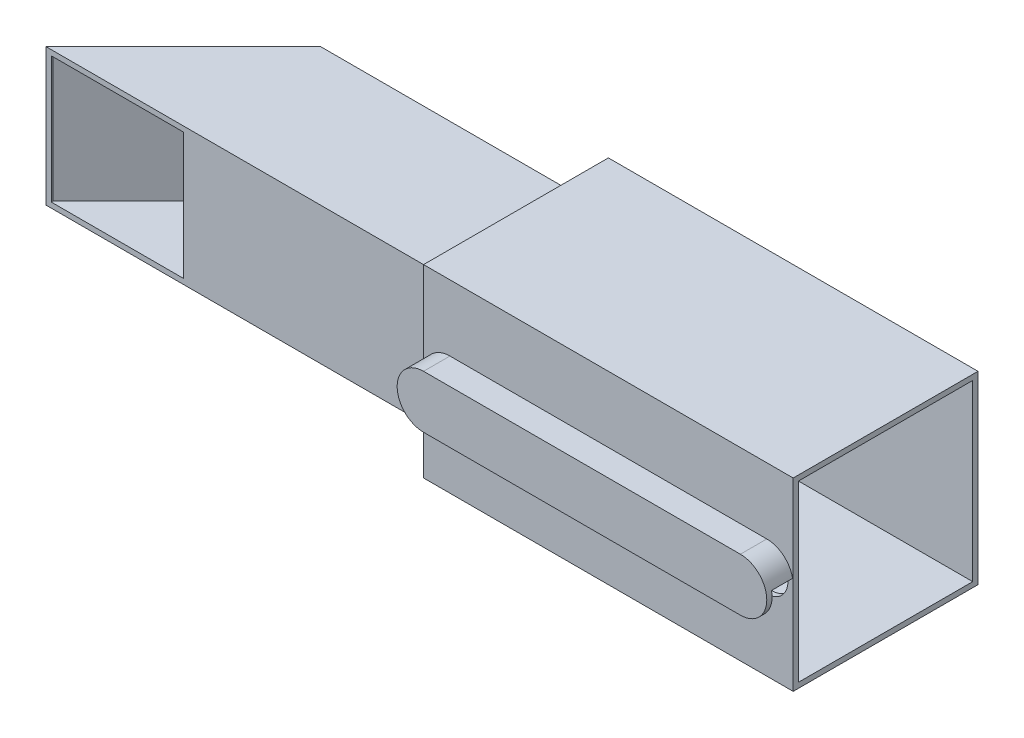
ISO-10303-21;
HEADER;
FILE_DESCRIPTION(('STEP AP214'),'2;1');
FILE_NAME('part.step','',(''),(''),'','','');
FILE_SCHEMA(('AUTOMOTIVE_DESIGN { 1 0 10303 214 1 1 1 1 }'));
ENDSEC;
DATA;
#1=APPLICATION_CONTEXT('core data for automotive mechanical design processes');
#2=APPLICATION_PROTOCOL_DEFINITION('international standard','automotive_design',2000,#1);
#3=PRODUCT_CONTEXT('',#1,'mechanical');
#4=PRODUCT('Part','Part','',(#3));
#5=PRODUCT_RELATED_PRODUCT_CATEGORY('part','',(#4));
#6=PRODUCT_DEFINITION_FORMATION('','',#4);
#7=PRODUCT_DEFINITION_CONTEXT('part definition',#1,'design');
#8=PRODUCT_DEFINITION('design','',#6,#7);
#9=PRODUCT_DEFINITION_SHAPE('','',#8);
#10=(LENGTH_UNIT() NAMED_UNIT(*) SI_UNIT(.MILLI.,.METRE.));
#11=(NAMED_UNIT(*) PLANE_ANGLE_UNIT() SI_UNIT($,.RADIAN.));
#12=(NAMED_UNIT(*) SI_UNIT($,.STERADIAN.) SOLID_ANGLE_UNIT());
#13=UNCERTAINTY_MEASURE_WITH_UNIT(LENGTH_MEASURE(1.E-05),#10,'distance_accuracy_value','');
#14=(GEOMETRIC_REPRESENTATION_CONTEXT(3) GLOBAL_UNCERTAINTY_ASSIGNED_CONTEXT((#13)) GLOBAL_UNIT_ASSIGNED_CONTEXT((#10,
#11,#12)) REPRESENTATION_CONTEXT('',''));
#15=CARTESIAN_POINT('',(0.,0.,0.));
#16=DIRECTION('',(0.,0.,1.));
#17=DIRECTION('',(1.,0.,0.));
#18=AXIS2_PLACEMENT_3D('',#15,#16,#17);
#19=CARTESIAN_POINT('',(70.,17.5,17.5));
#20=DIRECTION('',(-1.,0.,0.));
#21=DIRECTION('',(0.,0.,1.));
#22=AXIS2_PLACEMENT_3D('',#19,#20,#21);
#23=PLANE('',#22);
#24=DIRECTION('',(0.,1.,0.));
#25=VECTOR('',#24,1.);
#26=CARTESIAN_POINT('',(70.,17.5,-17.5));
#27=LINE('',#26,#25);
#28=CARTESIAN_POINT('',(70.,-17.5,-17.5));
#29=VERTEX_POINT('',#28);
#30=CARTESIAN_POINT('',(70.,17.5,-17.5));
#31=VERTEX_POINT('',#30);
#32=EDGE_CURVE('E487',#29,#31,#27,.T.);
#33=ORIENTED_EDGE('',*,*,#32,.T.);
#34=DIRECTION('',(0.,0.,-1.));
#35=VECTOR('',#34,1.);
#36=CARTESIAN_POINT('',(70.,17.5,17.5));
#37=LINE('',#36,#35);
#38=CARTESIAN_POINT('',(70.,17.5,17.5));
#39=VERTEX_POINT('',#38);
#40=EDGE_CURVE('E497',#39,#31,#37,.T.);
#41=ORIENTED_EDGE('',*,*,#40,.F.);
#42=DIRECTION('',(0.,1.,0.));
#43=VECTOR('',#42,1.);
#44=CARTESIAN_POINT('',(70.,17.5,17.5));
#45=LINE('',#44,#43);
#46=CARTESIAN_POINT('',(70.,-17.5,17.5));
#47=VERTEX_POINT('',#46);
#48=EDGE_CURVE('E477',#47,#39,#45,.T.);
#49=ORIENTED_EDGE('',*,*,#48,.F.);
#50=DIRECTION('',(0.,0.,-1.));
#51=VECTOR('',#50,1.);
#52=CARTESIAN_POINT('',(70.,-17.5,17.5));
#53=LINE('',#52,#51);
#54=EDGE_CURVE('E455',#47,#29,#53,.T.);
#55=ORIENTED_EDGE('',*,*,#54,.T.);
#56=EDGE_LOOP('',(#33,#41,#49,#55));
#57=FACE_BOUND('',#56,.T.);
#58=DIRECTION('',(0.,1.,0.));
#59=VECTOR('',#58,1.);
#60=CARTESIAN_POINT('',(70.,17.5,-16.5));
#61=LINE('',#60,#59);
#62=CARTESIAN_POINT('',(70.,-16.5,-16.5));
#63=VERTEX_POINT('',#62);
#64=CARTESIAN_POINT('',(70.,16.5,-16.5));
#65=VERTEX_POINT('',#64);
#66=EDGE_CURVE('E413',#63,#65,#61,.T.);
#67=ORIENTED_EDGE('',*,*,#66,.F.);
#68=DIRECTION('',(0.,0.,-1.));
#69=VECTOR('',#68,1.);
#70=CARTESIAN_POINT('',(70.,-16.5,17.5));
#71=LINE('',#70,#69);
#72=CARTESIAN_POINT('',(70.,-16.5,16.5));
#73=VERTEX_POINT('',#72);
#74=EDGE_CURVE('E400',#73,#63,#71,.T.);
#75=ORIENTED_EDGE('',*,*,#74,.F.);
#76=DIRECTION('',(0.,1.,0.));
#77=VECTOR('',#76,1.);
#78=CARTESIAN_POINT('',(70.,17.5,16.5));
#79=LINE('',#78,#77);
#80=CARTESIAN_POINT('',(70.,16.5,16.5));
#81=VERTEX_POINT('',#80);
#82=EDGE_CURVE('E394',#73,#81,#79,.T.);
#83=ORIENTED_EDGE('',*,*,#82,.T.);
#84=DIRECTION('',(0.,0.,-1.));
#85=VECTOR('',#84,1.);
#86=CARTESIAN_POINT('',(70.,16.5,17.5));
#87=LINE('',#86,#85);
#88=EDGE_CURVE('E417',#81,#65,#87,.T.);
#89=ORIENTED_EDGE('',*,*,#88,.T.);
#90=EDGE_LOOP('',(#67,#75,#83,#89));
#91=FACE_BOUND('',#90,.T.);
#92=ADVANCED_FACE('F40',(#57,#91),#23,.F.);
#93=CARTESIAN_POINT('',(0.,0.,17.5));
#94=DIRECTION('',(0.,0.,1.));
#95=DIRECTION('',(1.,0.,0.));
#96=AXIS2_PLACEMENT_3D('',#93,#94,#95);
#97=PLANE('',#96);
#98=ORIENTED_EDGE('',*,*,#48,.T.);
#99=DIRECTION('',(-1.,0.,0.));
#100=VECTOR('',#99,1.);
#101=CARTESIAN_POINT('',(70.,17.5,17.5));
#102=LINE('',#101,#100);
#103=CARTESIAN_POINT('',(0.,17.5,17.5));
#104=VERTEX_POINT('',#103);
#105=EDGE_CURVE('E480',#39,#104,#102,.T.);
#106=ORIENTED_EDGE('',*,*,#105,.T.);
#107=DIRECTION('',(0.,-1.,0.));
#108=VECTOR('',#107,1.);
#109=CARTESIAN_POINT('',(0.,17.5,17.5));
#110=LINE('',#109,#108);
#111=CARTESIAN_POINT('',(0.,-17.5,17.5));
#112=VERTEX_POINT('',#111);
#113=EDGE_CURVE('E482',#104,#112,#110,.T.);
#114=ORIENTED_EDGE('',*,*,#113,.T.);
#115=DIRECTION('',(1.,0.,0.));
#116=VECTOR('',#115,1.);
#117=CARTESIAN_POINT('',(70.,-17.5,17.5));
#118=LINE('',#117,#116);
#119=EDGE_CURVE('E474',#112,#47,#118,.T.);
#120=ORIENTED_EDGE('',*,*,#119,.T.);
#121=EDGE_LOOP('',(#98,#106,#114,#120));
#122=FACE_BOUND('',#121,.T.);
#123=DIRECTION('',(1.,0.,0.));
#124=VECTOR('',#123,1.);
#125=CARTESIAN_POINT('',(0.,1.00000000000001,17.5));
#126=LINE('',#125,#124);
#127=CARTESIAN_POINT('',(0.101020514433658,1.00000000000001,17.5));
#128=VERTEX_POINT('',#127);
#129=CARTESIAN_POINT('',(1.1270166537926,1.00000000000001,17.5));
#130=VERTEX_POINT('',#129);
#131=EDGE_CURVE('E353',#128,#130,#126,.T.);
#132=ORIENTED_EDGE('',*,*,#131,.F.);
#133=CARTESIAN_POINT('',(5.,0.,17.5));
#134=DIRECTION('',(0.,0.,1.));
#135=DIRECTION('',(1.,0.,0.));
#136=AXIS2_PLACEMENT_3D('',#133,#134,#135);
#137=CIRCLE('',#136,4.99999999999999);
#138=CARTESIAN_POINT('',(5.,4.99999999999999,17.5));
#139=VERTEX_POINT('',#138);
#140=EDGE_CURVE('E48',#128,#139,#137,.F.);
#141=ORIENTED_EDGE('',*,*,#140,.T.);
#142=DIRECTION('',(1.,0.,0.));
#143=VECTOR('',#142,1.);
#144=CARTESIAN_POINT('',(5.,4.99999999999999,17.5));
#145=LINE('',#144,#143);
#146=CARTESIAN_POINT('',(65.,4.99999999999998,17.5));
#147=VERTEX_POINT('',#146);
#148=EDGE_CURVE('E449',#139,#147,#145,.T.);
#149=ORIENTED_EDGE('',*,*,#148,.T.);
#150=CARTESIAN_POINT('',(65.,0.,17.5));
#151=DIRECTION('',(0.,0.,1.));
#152=DIRECTION('',(1.,0.,0.));
#153=AXIS2_PLACEMENT_3D('',#150,#151,#152);
#154=CIRCLE('',#153,4.99999999999999);
#155=CARTESIAN_POINT('',(69.8989794855663,1.00000000000001,17.5));
#156=VERTEX_POINT('',#155);
#157=EDGE_CURVE('E446',#147,#156,#154,.F.);
#158=ORIENTED_EDGE('',*,*,#157,.T.);
#159=CARTESIAN_POINT('',(68.8729833462074,1.00000000000001,17.5));
#160=VERTEX_POINT('',#159);
#161=EDGE_CURVE('E351',#160,#156,#126,.T.);
#162=ORIENTED_EDGE('',*,*,#161,.F.);
#163=CARTESIAN_POINT('',(65.,0.,17.5));
#164=DIRECTION('',(0.,0.,-1.));
#165=DIRECTION('',(-1.,0.,0.));
#166=AXIS2_PLACEMENT_3D('',#163,#164,#165);
#167=CIRCLE('',#166,3.99999999999999);
#168=CARTESIAN_POINT('',(65.,-3.99999999999999,17.5));
#169=VERTEX_POINT('',#168);
#170=EDGE_CURVE('E373',#169,#160,#167,.F.);
#171=ORIENTED_EDGE('',*,*,#170,.F.);
#172=DIRECTION('',(1.,0.,0.));
#173=VECTOR('',#172,1.);
#174=CARTESIAN_POINT('',(5.,-3.99999999999999,17.5));
#175=LINE('',#174,#173);
#176=CARTESIAN_POINT('',(5.,-3.99999999999999,17.5));
#177=VERTEX_POINT('',#176);
#178=EDGE_CURVE('E12',#177,#169,#175,.T.);
#179=ORIENTED_EDGE('',*,*,#178,.F.);
#180=CARTESIAN_POINT('',(5.,0.,17.5));
#181=DIRECTION('',(0.,0.,-1.));
#182=DIRECTION('',(-1.,0.,0.));
#183=AXIS2_PLACEMENT_3D('',#180,#181,#182);
#184=CIRCLE('',#183,3.99999999999999);
#185=EDGE_CURVE('E376',#130,#177,#184,.F.);
#186=ORIENTED_EDGE('',*,*,#185,.F.);
#187=EDGE_LOOP('',(#132,#141,#149,#158,#162,#171,#179,#186));
#188=FACE_BOUND('',#187,.T.);
#189=ADVANCED_FACE('F520',(#122,#188),#97,.T.);
#190=CARTESIAN_POINT('',(70.,-17.5,17.5));
#191=DIRECTION('',(0.,1.,0.));
#192=DIRECTION('',(-1.,0.,0.));
#193=AXIS2_PLACEMENT_3D('',#190,#191,#192);
#194=PLANE('',#193);
#195=DIRECTION('',(1.,0.,0.));
#196=VECTOR('',#195,1.);
#197=CARTESIAN_POINT('',(70.,-17.5,-17.5));
#198=LINE('',#197,#196);
#199=CARTESIAN_POINT('',(0.,-17.5,-17.5));
#200=VERTEX_POINT('',#199);
#201=EDGE_CURVE('E453',#200,#29,#198,.T.);
#202=ORIENTED_EDGE('',*,*,#201,.T.);
#203=ORIENTED_EDGE('',*,*,#54,.F.);
#204=ORIENTED_EDGE('',*,*,#119,.F.);
#205=DIRECTION('',(0.,0.,-1.));
#206=VECTOR('',#205,1.);
#207=CARTESIAN_POINT('',(0.,-17.5,17.5));
#208=LINE('',#207,#206);
#209=EDGE_CURVE('E484',#112,#200,#208,.T.);
#210=ORIENTED_EDGE('',*,*,#209,.T.);
#211=EDGE_LOOP('',(#202,#203,#204,#210));
#212=FACE_BOUND('',#211,.T.);
#213=ADVANCED_FACE('F42',(#212),#194,.F.);
#214=CARTESIAN_POINT('',(70.,17.5,17.5));
#215=DIRECTION('',(0.,-1.,0.));
#216=DIRECTION('',(1.,0.,0.));
#217=AXIS2_PLACEMENT_3D('',#214,#215,#216);
#218=PLANE('',#217);
#219=DIRECTION('',(-1.,0.,0.));
#220=VECTOR('',#219,1.);
#221=CARTESIAN_POINT('',(70.,17.5,-17.5));
#222=LINE('',#221,#220);
#223=CARTESIAN_POINT('',(0.,17.5,-17.5));
#224=VERTEX_POINT('',#223);
#225=EDGE_CURVE('E489',#31,#224,#222,.T.);
#226=ORIENTED_EDGE('',*,*,#225,.T.);
#227=DIRECTION('',(0.,0.,-1.));
#228=VECTOR('',#227,1.);
#229=CARTESIAN_POINT('',(0.,17.5,17.5));
#230=LINE('',#229,#228);
#231=EDGE_CURVE('E494',#104,#224,#230,.T.);
#232=ORIENTED_EDGE('',*,*,#231,.F.);
#233=ORIENTED_EDGE('',*,*,#105,.F.);
#234=ORIENTED_EDGE('',*,*,#40,.T.);
#235=EDGE_LOOP('',(#226,#232,#233,#234));
#236=FACE_BOUND('',#235,.T.);
#237=ADVANCED_FACE('F514',(#236),#218,.F.);
#238=CARTESIAN_POINT('',(0.,17.5,17.5));
#239=DIRECTION('',(1.,0.,0.));
#240=DIRECTION('',(0.,0.,-1.));
#241=AXIS2_PLACEMENT_3D('',#238,#239,#240);
#242=PLANE('',#241);
#243=DIRECTION('',(0.,0.,-1.));
#244=VECTOR('',#243,1.);
#245=CARTESIAN_POINT('',(0.,-13.,13.));
#246=LINE('',#245,#244);
#247=CARTESIAN_POINT('',(0.,-13.,13.));
#248=VERTEX_POINT('',#247);
#249=CARTESIAN_POINT('',(0.,-13.,-13.));
#250=VERTEX_POINT('',#249);
#251=EDGE_CURVE('E347',#248,#250,#246,.T.);
#252=ORIENTED_EDGE('',*,*,#251,.T.);
#253=DIRECTION('',(0.,1.,0.));
#254=VECTOR('',#253,1.);
#255=CARTESIAN_POINT('',(0.,-13.,-13.));
#256=LINE('',#255,#254);
#257=CARTESIAN_POINT('',(0.,13.,-13.));
#258=VERTEX_POINT('',#257);
#259=EDGE_CURVE('E338',#250,#258,#256,.T.);
#260=ORIENTED_EDGE('',*,*,#259,.T.);
#261=DIRECTION('',(0.,0.,-1.));
#262=VECTOR('',#261,1.);
#263=CARTESIAN_POINT('',(0.,13.,13.));
#264=LINE('',#263,#262);
#265=CARTESIAN_POINT('',(0.,13.,13.));
#266=VERTEX_POINT('',#265);
#267=EDGE_CURVE('E336',#266,#258,#264,.T.);
#268=ORIENTED_EDGE('',*,*,#267,.F.);
#269=DIRECTION('',(0.,1.,0.));
#270=VECTOR('',#269,1.);
#271=CARTESIAN_POINT('',(0.,-13.,13.));
#272=LINE('',#271,#270);
#273=EDGE_CURVE('E331',#248,#266,#272,.T.);
#274=ORIENTED_EDGE('',*,*,#273,.F.);
#275=EDGE_LOOP('',(#252,#260,#268,#274));
#276=FACE_BOUND('',#275,.T.);
#277=DIRECTION('',(0.,-1.,0.));
#278=VECTOR('',#277,1.);
#279=CARTESIAN_POINT('',(0.,17.5,-17.5));
#280=LINE('',#279,#278);
#281=EDGE_CURVE('E478',#224,#200,#280,.T.);
#282=ORIENTED_EDGE('',*,*,#281,.T.);
#283=ORIENTED_EDGE('',*,*,#209,.F.);
#284=ORIENTED_EDGE('',*,*,#113,.F.);
#285=ORIENTED_EDGE('',*,*,#231,.T.);
#286=EDGE_LOOP('',(#282,#283,#284,#285));
#287=FACE_BOUND('',#286,.T.);
#288=ADVANCED_FACE('F518',(#276,#287),#242,.F.);
#289=CARTESIAN_POINT('',(0.,0.,-17.5));
#290=DIRECTION('',(0.,0.,1.));
#291=DIRECTION('',(1.,0.,0.));
#292=AXIS2_PLACEMENT_3D('',#289,#290,#291);
#293=PLANE('',#292);
#294=ORIENTED_EDGE('',*,*,#201,.F.);
#295=ORIENTED_EDGE('',*,*,#281,.F.);
#296=ORIENTED_EDGE('',*,*,#225,.F.);
#297=ORIENTED_EDGE('',*,*,#32,.F.);
#298=EDGE_LOOP('',(#294,#295,#296,#297));
#299=FACE_BOUND('',#298,.T.);
#300=ADVANCED_FACE('F510',(#299),#293,.F.);
#301=CARTESIAN_POINT('',(5.,0.,-53.2106781186547));
#302=DIRECTION('',(0.,0.,1.));
#303=DIRECTION('',(1.,0.,0.));
#304=AXIS2_PLACEMENT_3D('',#301,#302,#303);
#305=CYLINDRICAL_SURFACE('',#304,4.99999999999999);
#306=CARTESIAN_POINT('',(5.,0.,21.5));
#307=DIRECTION('',(0.,0.,1.));
#308=DIRECTION('',(1.,0.,0.));
#309=AXIS2_PLACEMENT_3D('',#306,#307,#308);
#310=CIRCLE('',#309,4.99999999999999);
#311=CARTESIAN_POINT('',(5.,-4.99999999999999,21.5));
#312=VERTEX_POINT('',#311);
#313=CARTESIAN_POINT('',(0.101020514433658,1.00000000000001,21.5));
#314=VERTEX_POINT('',#313);
#315=EDGE_CURVE('E371',#312,#314,#310,.F.);
#316=ORIENTED_EDGE('',*,*,#315,.F.);
#317=DIRECTION('',(0.,0.,1.));
#318=VECTOR('',#317,1.);
#319=CARTESIAN_POINT('',(5.,-4.99999999999999,-53.2106781186547));
#320=LINE('',#319,#318);
#321=CARTESIAN_POINT('',(5.,-4.99999999999999,22.5));
#322=VERTEX_POINT('',#321);
#323=EDGE_CURVE('E467',#312,#322,#320,.T.);
#324=ORIENTED_EDGE('',*,*,#323,.T.);
#325=CARTESIAN_POINT('',(5.,0.,22.5));
#326=DIRECTION('',(0.,0.,1.));
#327=DIRECTION('',(1.,0.,0.));
#328=AXIS2_PLACEMENT_3D('',#325,#326,#327);
#329=CIRCLE('',#328,4.99999999999999);
#330=CARTESIAN_POINT('',(5.,4.99999999999999,22.5));
#331=VERTEX_POINT('',#330);
#332=EDGE_CURVE('E406',#331,#322,#329,.T.);
#333=ORIENTED_EDGE('',*,*,#332,.F.);
#334=DIRECTION('',(0.,0.,1.));
#335=VECTOR('',#334,1.);
#336=CARTESIAN_POINT('',(5.,4.99999999999999,-53.2106781186547));
#337=LINE('',#336,#335);
#338=EDGE_CURVE('E450',#139,#331,#337,.T.);
#339=ORIENTED_EDGE('',*,*,#338,.F.);
#340=ORIENTED_EDGE('',*,*,#140,.F.);
#341=DIRECTION('',(0.,0.,1.));
#342=VECTOR('',#341,1.);
#343=CARTESIAN_POINT('',(0.101020514433658,1.00000000000001,-53.2106781186547));
#344=LINE('',#343,#342);
#345=EDGE_CURVE('E366',#128,#314,#344,.T.);
#346=ORIENTED_EDGE('',*,*,#345,.T.);
#347=EDGE_LOOP('',(#316,#324,#333,#339,#340,#346));
#348=FACE_BOUND('',#347,.T.);
#349=ADVANCED_FACE('F533',(#348),#305,.T.);
#350=CARTESIAN_POINT('',(5.,4.99999999999999,-53.2106781186547));
#351=DIRECTION('',(0.,1.,0.));
#352=DIRECTION('',(0.,0.,1.));
#353=AXIS2_PLACEMENT_3D('',#350,#351,#352);
#354=PLANE('',#353);
#355=ORIENTED_EDGE('',*,*,#148,.F.);
#356=ORIENTED_EDGE('',*,*,#338,.T.);
#357=DIRECTION('',(-1.,0.,0.));
#358=VECTOR('',#357,1.);
#359=CARTESIAN_POINT('',(5.,4.99999999999999,22.5));
#360=LINE('',#359,#358);
#361=CARTESIAN_POINT('',(65.,4.99999999999998,22.5));
#362=VERTEX_POINT('',#361);
#363=EDGE_CURVE('E464',#362,#331,#360,.T.);
#364=ORIENTED_EDGE('',*,*,#363,.F.);
#365=DIRECTION('',(0.,0.,1.));
#366=VECTOR('',#365,1.);
#367=CARTESIAN_POINT('',(65.,4.99999999999998,-53.2106781186547));
#368=LINE('',#367,#366);
#369=EDGE_CURVE('E469',#147,#362,#368,.T.);
#370=ORIENTED_EDGE('',*,*,#369,.F.);
#371=EDGE_LOOP('',(#355,#356,#364,#370));
#372=FACE_BOUND('',#371,.T.);
#373=ADVANCED_FACE('F537',(#372),#354,.T.);
#374=CARTESIAN_POINT('',(65.,0.,-53.2106781186547));
#375=DIRECTION('',(0.,0.,1.));
#376=DIRECTION('',(1.,0.,0.));
#377=AXIS2_PLACEMENT_3D('',#374,#375,#376);
#378=CYLINDRICAL_SURFACE('',#377,4.99999999999999);
#379=CARTESIAN_POINT('',(65.,0.,21.5));
#380=DIRECTION('',(0.,0.,1.));
#381=DIRECTION('',(1.,0.,0.));
#382=AXIS2_PLACEMENT_3D('',#379,#380,#381);
#383=CIRCLE('',#382,4.99999999999999);
#384=CARTESIAN_POINT('',(69.8989794855663,1.00000000000001,21.5));
#385=VERTEX_POINT('',#384);
#386=CARTESIAN_POINT('',(65.,-4.99999999999999,21.5));
#387=VERTEX_POINT('',#386);
#388=EDGE_CURVE('E369',#385,#387,#383,.F.);
#389=ORIENTED_EDGE('',*,*,#388,.F.);
#390=DIRECTION('',(0.,0.,1.));
#391=VECTOR('',#390,1.);
#392=CARTESIAN_POINT('',(69.8989794855663,1.00000000000001,-53.2106781186547));
#393=LINE('',#392,#391);
#394=EDGE_CURVE('E363',#385,#156,#393,.F.);
#395=ORIENTED_EDGE('',*,*,#394,.T.);
#396=ORIENTED_EDGE('',*,*,#157,.F.);
#397=ORIENTED_EDGE('',*,*,#369,.T.);
#398=CARTESIAN_POINT('',(65.,0.,22.5));
#399=DIRECTION('',(0.,0.,1.));
#400=DIRECTION('',(1.,0.,0.));
#401=AXIS2_PLACEMENT_3D('',#398,#399,#400);
#402=CIRCLE('',#401,4.99999999999999);
#403=CARTESIAN_POINT('',(65.,-4.99999999999999,22.5));
#404=VERTEX_POINT('',#403);
#405=EDGE_CURVE('E461',#404,#362,#402,.T.);
#406=ORIENTED_EDGE('',*,*,#405,.F.);
#407=DIRECTION('',(0.,0.,1.));
#408=VECTOR('',#407,1.);
#409=CARTESIAN_POINT('',(65.,-4.99999999999999,-53.2106781186547));
#410=LINE('',#409,#408);
#411=EDGE_CURVE('E471',#387,#404,#410,.T.);
#412=ORIENTED_EDGE('',*,*,#411,.F.);
#413=EDGE_LOOP('',(#389,#395,#396,#397,#406,#412));
#414=FACE_BOUND('',#413,.T.);
#415=ADVANCED_FACE('F541',(#414),#378,.T.);
#416=CARTESIAN_POINT('',(5.,-4.99999999999999,-53.2106781186547));
#417=DIRECTION('',(0.,-1.,0.));
#418=DIRECTION('',(0.,0.,-1.));
#419=AXIS2_PLACEMENT_3D('',#416,#417,#418);
#420=PLANE('',#419);
#421=DIRECTION('',(-1.,0.,0.));
#422=VECTOR('',#421,1.);
#423=CARTESIAN_POINT('',(0.,-4.99999999999999,21.5));
#424=LINE('',#423,#422);
#425=EDGE_CURVE('E350',#387,#312,#424,.T.);
#426=ORIENTED_EDGE('',*,*,#425,.F.);
#427=ORIENTED_EDGE('',*,*,#411,.T.);
#428=DIRECTION('',(1.,0.,0.));
#429=VECTOR('',#428,1.);
#430=CARTESIAN_POINT('',(5.,-4.99999999999999,22.5));
#431=LINE('',#430,#429);
#432=EDGE_CURVE('E458',#322,#404,#431,.T.);
#433=ORIENTED_EDGE('',*,*,#432,.F.);
#434=ORIENTED_EDGE('',*,*,#323,.F.);
#435=EDGE_LOOP('',(#426,#427,#433,#434));
#436=FACE_BOUND('',#435,.T.);
#437=ADVANCED_FACE('F575',(#436),#420,.T.);
#438=CARTESIAN_POINT('',(5.,0.,22.5));
#439=DIRECTION('',(0.,0.,1.));
#440=DIRECTION('',(1.,0.,0.));
#441=AXIS2_PLACEMENT_3D('',#438,#439,#440);
#442=PLANE('',#441);
#443=ORIENTED_EDGE('',*,*,#332,.T.);
#444=ORIENTED_EDGE('',*,*,#432,.T.);
#445=ORIENTED_EDGE('',*,*,#405,.T.);
#446=ORIENTED_EDGE('',*,*,#363,.T.);
#447=EDGE_LOOP('',(#443,#444,#445,#446));
#448=FACE_BOUND('',#447,.T.);
#449=ADVANCED_FACE('F577',(#448),#442,.T.);
#450=CARTESIAN_POINT('',(0.,0.,16.5));
#451=DIRECTION('',(0.,0.,1.));
#452=DIRECTION('',(1.,0.,0.));
#453=AXIS2_PLACEMENT_3D('',#450,#451,#452);
#454=PLANE('',#453);
#455=DIRECTION('',(0.,-1.,0.));
#456=VECTOR('',#455,1.);
#457=CARTESIAN_POINT('',(1.,17.5,16.5));
#458=LINE('',#457,#456);
#459=CARTESIAN_POINT('',(1.,16.5,16.5));
#460=VERTEX_POINT('',#459);
#461=CARTESIAN_POINT('',(1.,0.,16.5));
#462=VERTEX_POINT('',#461);
#463=EDGE_CURVE('E390',#460,#462,#458,.T.);
#464=ORIENTED_EDGE('',*,*,#463,.F.);
#465=DIRECTION('',(-1.,0.,0.));
#466=VECTOR('',#465,1.);
#467=CARTESIAN_POINT('',(70.,16.5,16.5));
#468=LINE('',#467,#466);
#469=EDGE_CURVE('E391',#81,#460,#468,.T.);
#470=ORIENTED_EDGE('',*,*,#469,.F.);
#471=ORIENTED_EDGE('',*,*,#82,.F.);
#472=DIRECTION('',(1.,0.,0.));
#473=VECTOR('',#472,1.);
#474=CARTESIAN_POINT('',(70.,-16.5,16.5));
#475=LINE('',#474,#473);
#476=CARTESIAN_POINT('',(1.,-16.5,16.5));
#477=VERTEX_POINT('',#476);
#478=EDGE_CURVE('E392',#477,#73,#475,.T.);
#479=ORIENTED_EDGE('',*,*,#478,.F.);
#480=DIRECTION('',(0.,-1.,0.));
#481=VECTOR('',#480,1.);
#482=CARTESIAN_POINT('',(1.,17.5,16.5));
#483=LINE('',#482,#481);
#484=EDGE_CURVE('E388',#462,#477,#483,.T.);
#485=ORIENTED_EDGE('',*,*,#484,.F.);
#486=CARTESIAN_POINT('',(5.,0.,16.5));
#487=DIRECTION('',(0.,0.,1.));
#488=DIRECTION('',(1.,0.,0.));
#489=AXIS2_PLACEMENT_3D('',#486,#487,#488);
#490=CIRCLE('',#489,3.99999999999999);
#491=CARTESIAN_POINT('',(5.,-4.,16.5));
#492=VERTEX_POINT('',#491);
#493=EDGE_CURVE('E384',#492,#462,#490,.F.);
#494=ORIENTED_EDGE('',*,*,#493,.F.);
#495=DIRECTION('',(-1.,0.,0.));
#496=VECTOR('',#495,1.);
#497=CARTESIAN_POINT('',(5.,-3.99999999999999,16.5));
#498=LINE('',#497,#496);
#499=CARTESIAN_POINT('',(65.,-3.99999999999999,16.5));
#500=VERTEX_POINT('',#499);
#501=EDGE_CURVE('E380',#500,#492,#498,.T.);
#502=ORIENTED_EDGE('',*,*,#501,.F.);
#503=CARTESIAN_POINT('',(65.,0.,16.5));
#504=DIRECTION('',(0.,0.,1.));
#505=DIRECTION('',(1.,0.,0.));
#506=AXIS2_PLACEMENT_3D('',#503,#504,#505);
#507=CIRCLE('',#506,3.99999999999999);
#508=CARTESIAN_POINT('',(65.,3.99999999999998,16.5));
#509=VERTEX_POINT('',#508);
#510=EDGE_CURVE('E396',#509,#500,#507,.F.);
#511=ORIENTED_EDGE('',*,*,#510,.F.);
#512=DIRECTION('',(1.,0.,0.));
#513=VECTOR('',#512,1.);
#514=CARTESIAN_POINT('',(5.,3.99999999999999,16.5));
#515=LINE('',#514,#513);
#516=CARTESIAN_POINT('',(5.,3.99999999999999,16.5));
#517=VERTEX_POINT('',#516);
#518=EDGE_CURVE('E387',#517,#509,#515,.T.);
#519=ORIENTED_EDGE('',*,*,#518,.F.);
#520=CARTESIAN_POINT('',(5.,0.,16.5));
#521=DIRECTION('',(0.,0.,1.));
#522=DIRECTION('',(1.,0.,0.));
#523=AXIS2_PLACEMENT_3D('',#520,#521,#522);
#524=CIRCLE('',#523,3.99999999999999);
#525=EDGE_CURVE('E399',#462,#517,#524,.F.);
#526=ORIENTED_EDGE('',*,*,#525,.F.);
#527=EDGE_LOOP('',(#464,#470,#471,#479,#485,#494,#502,#511,#519,#526));
#528=FACE_BOUND('',#527,.T.);
#529=ADVANCED_FACE('F563',(#528),#454,.F.);
#530=CARTESIAN_POINT('',(70.,-16.5,17.5));
#531=DIRECTION('',(0.,1.,0.));
#532=DIRECTION('',(-1.,0.,0.));
#533=AXIS2_PLACEMENT_3D('',#530,#531,#532);
#534=PLANE('',#533);
#535=DIRECTION('',(1.,0.,0.));
#536=VECTOR('',#535,1.);
#537=CARTESIAN_POINT('',(70.,-16.5,-16.5));
#538=LINE('',#537,#536);
#539=CARTESIAN_POINT('',(1.,-16.5,-16.5));
#540=VERTEX_POINT('',#539);
#541=EDGE_CURVE('E383',#540,#63,#538,.T.);
#542=ORIENTED_EDGE('',*,*,#541,.F.);
#543=DIRECTION('',(0.,0.,-1.));
#544=VECTOR('',#543,1.);
#545=CARTESIAN_POINT('',(1.,-16.5,17.5));
#546=LINE('',#545,#544);
#547=EDGE_CURVE('E403',#477,#540,#546,.T.);
#548=ORIENTED_EDGE('',*,*,#547,.F.);
#549=ORIENTED_EDGE('',*,*,#478,.T.);
#550=ORIENTED_EDGE('',*,*,#74,.T.);
#551=EDGE_LOOP('',(#542,#548,#549,#550));
#552=FACE_BOUND('',#551,.T.);
#553=ADVANCED_FACE('F584',(#552),#534,.T.);
#554=CARTESIAN_POINT('',(70.,16.5,17.5));
#555=DIRECTION('',(0.,-1.,0.));
#556=DIRECTION('',(1.,0.,0.));
#557=AXIS2_PLACEMENT_3D('',#554,#555,#556);
#558=PLANE('',#557);
#559=DIRECTION('',(-1.,0.,0.));
#560=VECTOR('',#559,1.);
#561=CARTESIAN_POINT('',(70.,16.5,-16.5));
#562=LINE('',#561,#560);
#563=CARTESIAN_POINT('',(1.,16.5,-16.5));
#564=VERTEX_POINT('',#563);
#565=EDGE_CURVE('E411',#65,#564,#562,.T.);
#566=ORIENTED_EDGE('',*,*,#565,.F.);
#567=ORIENTED_EDGE('',*,*,#88,.F.);
#568=ORIENTED_EDGE('',*,*,#469,.T.);
#569=DIRECTION('',(0.,0.,-1.));
#570=VECTOR('',#569,1.);
#571=CARTESIAN_POINT('',(1.,16.5,17.5));
#572=LINE('',#571,#570);
#573=EDGE_CURVE('E414',#460,#564,#572,.T.);
#574=ORIENTED_EDGE('',*,*,#573,.T.);
#575=EDGE_LOOP('',(#566,#567,#568,#574));
#576=FACE_BOUND('',#575,.T.);
#577=ADVANCED_FACE('F665',(#576),#558,.T.);
#578=CARTESIAN_POINT('',(1.,17.5,17.5));
#579=DIRECTION('',(1.,0.,0.));
#580=DIRECTION('',(0.,0.,-1.));
#581=AXIS2_PLACEMENT_3D('',#578,#579,#580);
#582=PLANE('',#581);
#583=DIRECTION('',(0.,0.,1.));
#584=VECTOR('',#583,1.);
#585=CARTESIAN_POINT('',(1.,-12.,-12.));
#586=LINE('',#585,#584);
#587=CARTESIAN_POINT('',(1.,-12.,-12.));
#588=VERTEX_POINT('',#587);
#589=CARTESIAN_POINT('',(1.,-12.,12.));
#590=VERTEX_POINT('',#589);
#591=EDGE_CURVE('E305',#588,#590,#586,.T.);
#592=ORIENTED_EDGE('',*,*,#591,.T.);
#593=DIRECTION('',(0.,1.,0.));
#594=VECTOR('',#593,1.);
#595=CARTESIAN_POINT('',(1.,-12.,12.));
#596=LINE('',#595,#594);
#597=CARTESIAN_POINT('',(1.,12.,12.));
#598=VERTEX_POINT('',#597);
#599=EDGE_CURVE('E308',#590,#598,#596,.T.);
#600=ORIENTED_EDGE('',*,*,#599,.T.);
#601=DIRECTION('',(0.,0.,-1.));
#602=VECTOR('',#601,1.);
#603=CARTESIAN_POINT('',(1.,12.,-12.));
#604=LINE('',#603,#602);
#605=CARTESIAN_POINT('',(1.,12.,-12.));
#606=VERTEX_POINT('',#605);
#607=EDGE_CURVE('E312',#598,#606,#604,.T.);
#608=ORIENTED_EDGE('',*,*,#607,.T.);
#609=DIRECTION('',(0.,-1.,0.));
#610=VECTOR('',#609,1.);
#611=CARTESIAN_POINT('',(1.,-12.,-12.));
#612=LINE('',#611,#610);
#613=EDGE_CURVE('E309',#606,#588,#612,.T.);
#614=ORIENTED_EDGE('',*,*,#613,.T.);
#615=EDGE_LOOP('',(#592,#600,#608,#614));
#616=FACE_BOUND('',#615,.T.);
#617=DIRECTION('',(0.,-1.,0.));
#618=VECTOR('',#617,1.);
#619=CARTESIAN_POINT('',(1.,17.5,-16.5));
#620=LINE('',#619,#618);
#621=EDGE_CURVE('E395',#564,#540,#620,.T.);
#622=ORIENTED_EDGE('',*,*,#621,.F.);
#623=ORIENTED_EDGE('',*,*,#573,.F.);
#624=ORIENTED_EDGE('',*,*,#463,.T.);
#625=ORIENTED_EDGE('',*,*,#484,.T.);
#626=ORIENTED_EDGE('',*,*,#547,.T.);
#627=EDGE_LOOP('',(#622,#623,#624,#625,#626));
#628=FACE_BOUND('',#627,.T.);
#629=ADVANCED_FACE('F674',(#616,#628),#582,.T.);
#630=CARTESIAN_POINT('',(0.,0.,-16.5));
#631=DIRECTION('',(0.,0.,1.));
#632=DIRECTION('',(1.,0.,0.));
#633=AXIS2_PLACEMENT_3D('',#630,#631,#632);
#634=PLANE('',#633);
#635=ORIENTED_EDGE('',*,*,#541,.T.);
#636=ORIENTED_EDGE('',*,*,#66,.T.);
#637=ORIENTED_EDGE('',*,*,#565,.T.);
#638=ORIENTED_EDGE('',*,*,#621,.T.);
#639=EDGE_LOOP('',(#635,#636,#637,#638));
#640=FACE_BOUND('',#639,.T.);
#641=ADVANCED_FACE('F684',(#640),#634,.T.);
#642=CARTESIAN_POINT('',(5.,0.,-53.2106781186547));
#643=DIRECTION('',(0.,0.,1.));
#644=DIRECTION('',(1.,0.,0.));
#645=AXIS2_PLACEMENT_3D('',#642,#643,#644);
#646=CYLINDRICAL_SURFACE('',#645,3.99999999999999);
#647=DIRECTION('',(0.,0.,1.));
#648=VECTOR('',#647,1.);
#649=CARTESIAN_POINT('',(1.1270166537926,1.00000000000001,-53.2106781186547));
#650=LINE('',#649,#648);
#651=CARTESIAN_POINT('',(1.1270166537926,1.00000000000001,21.5));
#652=VERTEX_POINT('',#651);
#653=EDGE_CURVE('E361',#130,#652,#650,.T.);
#654=ORIENTED_EDGE('',*,*,#653,.F.);
#655=ORIENTED_EDGE('',*,*,#185,.T.);
#656=DIRECTION('',(0.,0.,1.));
#657=VECTOR('',#656,1.);
#658=CARTESIAN_POINT('',(5.,-4.,-53.2106781186547));
#659=LINE('',#658,#657);
#660=EDGE_CURVE('E423',#492,#177,#659,.T.);
#661=ORIENTED_EDGE('',*,*,#660,.F.);
#662=ORIENTED_EDGE('',*,*,#493,.T.);
#663=ORIENTED_EDGE('',*,*,#525,.T.);
#664=DIRECTION('',(0.,0.,1.));
#665=VECTOR('',#664,1.);
#666=CARTESIAN_POINT('',(5.,3.99999999999999,-53.2106781186547));
#667=LINE('',#666,#665);
#668=CARTESIAN_POINT('',(5.,3.99999999999999,21.5));
#669=VERTEX_POINT('',#668);
#670=EDGE_CURVE('E409',#517,#669,#667,.T.);
#671=ORIENTED_EDGE('',*,*,#670,.T.);
#672=CARTESIAN_POINT('',(5.,0.,21.5));
#673=DIRECTION('',(0.,0.,1.));
#674=DIRECTION('',(1.,0.,0.));
#675=AXIS2_PLACEMENT_3D('',#672,#673,#674);
#676=CIRCLE('',#675,3.99999999999999);
#677=EDGE_CURVE('E379',#669,#652,#676,.T.);
#678=ORIENTED_EDGE('',*,*,#677,.T.);
#679=EDGE_LOOP('',(#654,#655,#661,#662,#663,#671,#678));
#680=FACE_BOUND('',#679,.T.);
#681=ADVANCED_FACE('F569',(#680),#646,.F.);
#682=CARTESIAN_POINT('',(5.,3.99999999999999,-53.2106781186547));
#683=DIRECTION('',(0.,1.,0.));
#684=DIRECTION('',(0.,0.,1.));
#685=AXIS2_PLACEMENT_3D('',#682,#683,#684);
#686=PLANE('',#685);
#687=ORIENTED_EDGE('',*,*,#518,.T.);
#688=DIRECTION('',(0.,0.,1.));
#689=VECTOR('',#688,1.);
#690=CARTESIAN_POINT('',(65.,3.99999999999998,-53.2106781186547));
#691=LINE('',#690,#689);
#692=CARTESIAN_POINT('',(65.,3.99999999999998,21.5));
#693=VERTEX_POINT('',#692);
#694=EDGE_CURVE('E432',#509,#693,#691,.T.);
#695=ORIENTED_EDGE('',*,*,#694,.T.);
#696=DIRECTION('',(-1.,0.,0.));
#697=VECTOR('',#696,1.);
#698=CARTESIAN_POINT('',(5.,3.99999999999999,21.5));
#699=LINE('',#698,#697);
#700=EDGE_CURVE('E427',#693,#669,#699,.T.);
#701=ORIENTED_EDGE('',*,*,#700,.T.);
#702=ORIENTED_EDGE('',*,*,#670,.F.);
#703=EDGE_LOOP('',(#687,#695,#701,#702));
#704=FACE_BOUND('',#703,.T.);
#705=ADVANCED_FACE('F559',(#704),#686,.F.);
#706=CARTESIAN_POINT('',(65.,0.,-53.2106781186547));
#707=DIRECTION('',(0.,0.,1.));
#708=DIRECTION('',(1.,0.,0.));
#709=AXIS2_PLACEMENT_3D('',#706,#707,#708);
#710=CYLINDRICAL_SURFACE('',#709,3.99999999999999);
#711=DIRECTION('',(0.,0.,-1.));
#712=VECTOR('',#711,1.);
#713=CARTESIAN_POINT('',(65.,-3.99999999999999,-53.2106781186547));
#714=LINE('',#713,#712);
#715=EDGE_CURVE('E426',#500,#169,#714,.F.);
#716=ORIENTED_EDGE('',*,*,#715,.T.);
#717=ORIENTED_EDGE('',*,*,#170,.T.);
#718=DIRECTION('',(0.,0.,1.));
#719=VECTOR('',#718,1.);
#720=CARTESIAN_POINT('',(68.8729833462074,1.00000000000001,-53.2106781186547));
#721=LINE('',#720,#719);
#722=CARTESIAN_POINT('',(68.8729833462074,1.00000000000001,21.5));
#723=VERTEX_POINT('',#722);
#724=EDGE_CURVE('E359',#723,#160,#721,.F.);
#725=ORIENTED_EDGE('',*,*,#724,.F.);
#726=CARTESIAN_POINT('',(65.,0.,21.5));
#727=DIRECTION('',(0.,0.,1.));
#728=DIRECTION('',(1.,0.,0.));
#729=AXIS2_PLACEMENT_3D('',#726,#727,#728);
#730=CIRCLE('',#729,3.99999999999999);
#731=EDGE_CURVE('E430',#723,#693,#730,.T.);
#732=ORIENTED_EDGE('',*,*,#731,.T.);
#733=ORIENTED_EDGE('',*,*,#694,.F.);
#734=ORIENTED_EDGE('',*,*,#510,.T.);
#735=EDGE_LOOP('',(#716,#717,#725,#732,#733,#734));
#736=FACE_BOUND('',#735,.T.);
#737=ADVANCED_FACE('F557',(#736),#710,.F.);
#738=CARTESIAN_POINT('',(5.,-3.99999999999999,-53.2106781186547));
#739=DIRECTION('',(0.,-1.,0.));
#740=DIRECTION('',(0.,0.,-1.));
#741=AXIS2_PLACEMENT_3D('',#738,#739,#740);
#742=PLANE('',#741);
#743=ORIENTED_EDGE('',*,*,#660,.T.);
#744=ORIENTED_EDGE('',*,*,#178,.T.);
#745=ORIENTED_EDGE('',*,*,#715,.F.);
#746=ORIENTED_EDGE('',*,*,#501,.T.);
#747=EDGE_LOOP('',(#743,#744,#745,#746));
#748=FACE_BOUND('',#747,.T.);
#749=ADVANCED_FACE('F567',(#748),#742,.F.);
#750=CARTESIAN_POINT('',(5.,0.,21.5));
#751=DIRECTION('',(0.,0.,1.));
#752=DIRECTION('',(1.,0.,0.));
#753=AXIS2_PLACEMENT_3D('',#750,#751,#752);
#754=PLANE('',#753);
#755=ORIENTED_EDGE('',*,*,#731,.F.);
#756=DIRECTION('',(-1.,0.,0.));
#757=VECTOR('',#756,1.);
#758=CARTESIAN_POINT('',(0.,1.00000000000001,21.5));
#759=LINE('',#758,#757);
#760=EDGE_CURVE('E357',#385,#723,#759,.T.);
#761=ORIENTED_EDGE('',*,*,#760,.F.);
#762=ORIENTED_EDGE('',*,*,#388,.T.);
#763=ORIENTED_EDGE('',*,*,#425,.T.);
#764=ORIENTED_EDGE('',*,*,#315,.T.);
#765=EDGE_CURVE('E354',#652,#314,#759,.T.);
#766=ORIENTED_EDGE('',*,*,#765,.F.);
#767=ORIENTED_EDGE('',*,*,#677,.F.);
#768=ORIENTED_EDGE('',*,*,#700,.F.);
#769=EDGE_LOOP('',(#755,#761,#762,#763,#764,#766,#767,#768));
#770=FACE_BOUND('',#769,.T.);
#771=ADVANCED_FACE('F551',(#770),#754,.F.);
#772=CARTESIAN_POINT('',(0.,1.00000000000001,0.));
#773=DIRECTION('',(0.,-1.,0.));
#774=DIRECTION('',(0.,0.,-1.));
#775=AXIS2_PLACEMENT_3D('',#772,#773,#774);
#776=PLANE('',#775);
#777=ORIENTED_EDGE('',*,*,#131,.T.);
#778=ORIENTED_EDGE('',*,*,#653,.T.);
#779=ORIENTED_EDGE('',*,*,#765,.T.);
#780=ORIENTED_EDGE('',*,*,#345,.F.);
#781=EDGE_LOOP('',(#777,#778,#779,#780));
#782=FACE_BOUND('',#781,.T.);
#783=ADVANCED_FACE('F571',(#782),#776,.T.);
#784=ORIENTED_EDGE('',*,*,#760,.T.);
#785=ORIENTED_EDGE('',*,*,#724,.T.);
#786=ORIENTED_EDGE('',*,*,#161,.T.);
#787=ORIENTED_EDGE('',*,*,#394,.F.);
#788=EDGE_LOOP('',(#784,#785,#786,#787));
#789=FACE_BOUND('',#788,.T.);
#790=ADVANCED_FACE('F547',(#789),#776,.T.);
#791=CARTESIAN_POINT('',(0.,-13.,13.));
#792=DIRECTION('',(0.,1.,0.));
#793=DIRECTION('',(-1.,0.,0.));
#794=AXIS2_PLACEMENT_3D('',#791,#792,#793);
#795=PLANE('',#794);
#796=DIRECTION('',(1.,0.,0.));
#797=VECTOR('',#796,1.);
#798=CARTESIAN_POINT('',(0.,-13.,-13.));
#799=LINE('',#798,#797);
#800=CARTESIAN_POINT('',(-50.,-13.,-13.));
#801=VERTEX_POINT('',#800);
#802=EDGE_CURVE('E325',#801,#250,#799,.T.);
#803=ORIENTED_EDGE('',*,*,#802,.T.);
#804=ORIENTED_EDGE('',*,*,#251,.F.);
#805=DIRECTION('',(1.,0.,0.));
#806=VECTOR('',#805,1.);
#807=CARTESIAN_POINT('',(0.,-13.,13.));
#808=LINE('',#807,#806);
#809=CARTESIAN_POINT('',(-75.9999999999997,-13.,13.));
#810=VERTEX_POINT('',#809);
#811=EDGE_CURVE('E329',#810,#248,#808,.T.);
#812=ORIENTED_EDGE('',*,*,#811,.F.);
#813=DIRECTION('',(-0.707106781186544,0.,0.707106781186551));
#814=VECTOR('',#813,1.);
#815=CARTESIAN_POINT('',(-75.9999999999997,-13.,13.));
#816=LINE('',#815,#814);
#817=EDGE_CURVE('E296',#801,#810,#816,.T.);
#818=ORIENTED_EDGE('',*,*,#817,.F.);
#819=EDGE_LOOP('',(#803,#804,#812,#818));
#820=FACE_BOUND('',#819,.T.);
#821=ADVANCED_FACE('F768',(#820),#795,.F.);
#822=CARTESIAN_POINT('',(0.,13.,13.));
#823=DIRECTION('',(0.,-1.,0.));
#824=DIRECTION('',(1.,0.,0.));
#825=AXIS2_PLACEMENT_3D('',#822,#823,#824);
#826=PLANE('',#825);
#827=DIRECTION('',(-1.,0.,0.));
#828=VECTOR('',#827,1.);
#829=CARTESIAN_POINT('',(0.,13.,-13.));
#830=LINE('',#829,#828);
#831=CARTESIAN_POINT('',(-50.,13.,-13.));
#832=VERTEX_POINT('',#831);
#833=EDGE_CURVE('E341',#258,#832,#830,.T.);
#834=ORIENTED_EDGE('',*,*,#833,.T.);
#835=DIRECTION('',(-0.707106781186544,0.,0.707106781186551));
#836=VECTOR('',#835,1.);
#837=CARTESIAN_POINT('',(-75.9999999999997,13.,13.));
#838=LINE('',#837,#836);
#839=CARTESIAN_POINT('',(-75.9999999999997,13.,13.));
#840=VERTEX_POINT('',#839);
#841=EDGE_CURVE('E297',#832,#840,#838,.T.);
#842=ORIENTED_EDGE('',*,*,#841,.T.);
#843=DIRECTION('',(-1.,0.,0.));
#844=VECTOR('',#843,1.);
#845=CARTESIAN_POINT('',(0.,13.,13.));
#846=LINE('',#845,#844);
#847=EDGE_CURVE('E334',#266,#840,#846,.T.);
#848=ORIENTED_EDGE('',*,*,#847,.F.);
#849=ORIENTED_EDGE('',*,*,#267,.T.);
#850=EDGE_LOOP('',(#834,#842,#848,#849));
#851=FACE_BOUND('',#850,.T.);
#852=ADVANCED_FACE('F789',(#851),#826,.F.);
#853=CARTESIAN_POINT('',(0.,0.,13.));
#854=DIRECTION('',(0.,0.,1.));
#855=DIRECTION('',(1.,0.,0.));
#856=AXIS2_PLACEMENT_3D('',#853,#854,#855);
#857=PLANE('',#856);
#858=DIRECTION('',(-1.,0.,0.));
#859=VECTOR('',#858,1.);
#860=CARTESIAN_POINT('',(-49.9999999999997,12.,13.));
#861=LINE('',#860,#859);
#862=CARTESIAN_POINT('',(-49.9999999999997,12.,13.));
#863=VERTEX_POINT('',#862);
#864=CARTESIAN_POINT('',(-74.9999999999997,12.,13.));
#865=VERTEX_POINT('',#864);
#866=EDGE_CURVE('E55',#863,#865,#861,.T.);
#867=ORIENTED_EDGE('',*,*,#866,.F.);
#868=DIRECTION('',(0.,1.,0.));
#869=VECTOR('',#868,1.);
#870=CARTESIAN_POINT('',(-49.9999999999997,-12.,13.));
#871=LINE('',#870,#869);
#872=CARTESIAN_POINT('',(-49.9999999999997,-12.,13.));
#873=VERTEX_POINT('',#872);
#874=EDGE_CURVE('E278',#873,#863,#871,.T.);
#875=ORIENTED_EDGE('',*,*,#874,.F.);
#876=DIRECTION('',(1.,0.,0.));
#877=VECTOR('',#876,1.);
#878=CARTESIAN_POINT('',(-74.9999999999997,-12.,13.));
#879=LINE('',#878,#877);
#880=CARTESIAN_POINT('',(-74.9999999999997,-12.,13.));
#881=VERTEX_POINT('',#880);
#882=EDGE_CURVE('E260',#881,#873,#879,.T.);
#883=ORIENTED_EDGE('',*,*,#882,.F.);
#884=DIRECTION('',(0.,-1.,0.));
#885=VECTOR('',#884,1.);
#886=CARTESIAN_POINT('',(-74.9999999999997,12.,13.));
#887=LINE('',#886,#885);
#888=EDGE_CURVE('E271',#865,#881,#887,.T.);
#889=ORIENTED_EDGE('',*,*,#888,.F.);
#890=EDGE_LOOP('',(#867,#875,#883,#889));
#891=FACE_BOUND('',#890,.T.);
#892=ORIENTED_EDGE('',*,*,#811,.T.);
#893=ORIENTED_EDGE('',*,*,#273,.T.);
#894=ORIENTED_EDGE('',*,*,#847,.T.);
#895=DIRECTION('',(0.,-1.,0.));
#896=VECTOR('',#895,1.);
#897=CARTESIAN_POINT('',(-75.9999999999997,13.,13.));
#898=LINE('',#897,#896);
#899=EDGE_CURVE('E300',#840,#810,#898,.T.);
#900=ORIENTED_EDGE('',*,*,#899,.T.);
#901=EDGE_LOOP('',(#892,#893,#894,#900));
#902=FACE_BOUND('',#901,.T.);
#903=ADVANCED_FACE('F275',(#891,#902),#857,.T.);
#904=CARTESIAN_POINT('',(0.,0.,-13.));
#905=DIRECTION('',(0.,0.,1.));
#906=DIRECTION('',(1.,0.,0.));
#907=AXIS2_PLACEMENT_3D('',#904,#905,#906);
#908=PLANE('',#907);
#909=ORIENTED_EDGE('',*,*,#802,.F.);
#910=DIRECTION('',(0.,-1.,0.));
#911=VECTOR('',#910,1.);
#912=CARTESIAN_POINT('',(-50.,13.,-13.));
#913=LINE('',#912,#911);
#914=EDGE_CURVE('E332',#832,#801,#913,.T.);
#915=ORIENTED_EDGE('',*,*,#914,.F.);
#916=ORIENTED_EDGE('',*,*,#833,.F.);
#917=ORIENTED_EDGE('',*,*,#259,.F.);
#918=EDGE_LOOP('',(#909,#915,#916,#917));
#919=FACE_BOUND('',#918,.T.);
#920=ADVANCED_FACE('F805',(#919),#908,.F.);
#921=CARTESIAN_POINT('',(0.,-12.,13.));
#922=DIRECTION('',(0.,1.,0.));
#923=DIRECTION('',(-1.,0.,0.));
#924=AXIS2_PLACEMENT_3D('',#921,#922,#923);
#925=PLANE('',#924);
#926=DIRECTION('',(0.,0.,1.));
#927=VECTOR('',#926,1.);
#928=CARTESIAN_POINT('',(-49.9999999999997,-12.,-42.1257181796629));
#929=LINE('',#928,#927);
#930=CARTESIAN_POINT('',(-49.9999999999997,-12.,12.));
#931=VERTEX_POINT('',#930);
#932=EDGE_CURVE('E267',#931,#873,#929,.T.);
#933=ORIENTED_EDGE('',*,*,#932,.F.);
#934=DIRECTION('',(1.,0.,0.));
#935=VECTOR('',#934,1.);
#936=CARTESIAN_POINT('',(0.,-12.,12.));
#937=LINE('',#936,#935);
#938=EDGE_CURVE('E319',#931,#590,#937,.T.);
#939=ORIENTED_EDGE('',*,*,#938,.T.);
#940=ORIENTED_EDGE('',*,*,#591,.F.);
#941=DIRECTION('',(1.,0.,0.));
#942=VECTOR('',#941,1.);
#943=CARTESIAN_POINT('',(0.,-12.,-12.));
#944=LINE('',#943,#942);
#945=CARTESIAN_POINT('',(-49.9999999999997,-12.,-12.));
#946=VERTEX_POINT('',#945);
#947=EDGE_CURVE('E63',#946,#588,#944,.T.);
#948=ORIENTED_EDGE('',*,*,#947,.F.);
#949=CARTESIAN_POINT('',(-49.9999999999997,-12.,-12.2928932188137));
#950=VERTEX_POINT('',#949);
#951=EDGE_CURVE('E287',#950,#946,#929,.T.);
#952=ORIENTED_EDGE('',*,*,#951,.F.);
#953=DIRECTION('',(-0.707106781186544,0.,0.707106781186551));
#954=VECTOR('',#953,1.);
#955=CARTESIAN_POINT('',(-47.583587519575,-12.,-14.7093056992384));
#956=LINE('',#955,#954);
#957=CARTESIAN_POINT('',(-74.9999999999997,-12.,12.7071067811865));
#958=VERTEX_POINT('',#957);
#959=EDGE_CURVE('E264',#950,#958,#956,.T.);
#960=ORIENTED_EDGE('',*,*,#959,.T.);
#961=DIRECTION('',(0.,0.,1.));
#962=VECTOR('',#961,1.);
#963=CARTESIAN_POINT('',(-74.9999999999997,-12.,-42.1257181796629));
#964=LINE('',#963,#962);
#965=EDGE_CURVE('E255',#958,#881,#964,.T.);
#966=ORIENTED_EDGE('',*,*,#965,.T.);
#967=ORIENTED_EDGE('',*,*,#882,.T.);
#968=EDGE_LOOP('',(#933,#939,#940,#948,#952,#960,#966,#967));
#969=FACE_BOUND('',#968,.T.);
#970=ADVANCED_FACE('F258',(#969),#925,.T.);
#971=CARTESIAN_POINT('',(0.,12.,13.));
#972=DIRECTION('',(0.,-1.,0.));
#973=DIRECTION('',(1.,0.,0.));
#974=AXIS2_PLACEMENT_3D('',#971,#972,#973);
#975=PLANE('',#974);
#976=DIRECTION('',(0.,0.,1.));
#977=VECTOR('',#976,1.);
#978=CARTESIAN_POINT('',(-49.9999999999997,12.,-42.1257181796629));
#979=LINE('',#978,#977);
#980=CARTESIAN_POINT('',(-49.9999999999997,12.,-12.2928932188137));
#981=VERTEX_POINT('',#980);
#982=CARTESIAN_POINT('',(-49.9999999999997,12.,-12.));
#983=VERTEX_POINT('',#982);
#984=EDGE_CURVE('E283',#981,#983,#979,.T.);
#985=ORIENTED_EDGE('',*,*,#984,.T.);
#986=DIRECTION('',(-1.,0.,0.));
#987=VECTOR('',#986,1.);
#988=CARTESIAN_POINT('',(0.,12.,-12.));
#989=LINE('',#988,#987);
#990=EDGE_CURVE('E318',#606,#983,#989,.T.);
#991=ORIENTED_EDGE('',*,*,#990,.F.);
#992=ORIENTED_EDGE('',*,*,#607,.F.);
#993=DIRECTION('',(-1.,0.,0.));
#994=VECTOR('',#993,1.);
#995=CARTESIAN_POINT('',(0.,12.,12.));
#996=LINE('',#995,#994);
#997=CARTESIAN_POINT('',(-49.9999999999997,12.,12.));
#998=VERTEX_POINT('',#997);
#999=EDGE_CURVE('E321',#598,#998,#996,.T.);
#1000=ORIENTED_EDGE('',*,*,#999,.T.);
#1001=EDGE_CURVE('E286',#998,#863,#979,.T.);
#1002=ORIENTED_EDGE('',*,*,#1001,.T.);
#1003=ORIENTED_EDGE('',*,*,#866,.T.);
#1004=DIRECTION('',(0.,0.,1.));
#1005=VECTOR('',#1004,1.);
#1006=CARTESIAN_POINT('',(-74.9999999999997,12.,-42.1257181796629));
#1007=LINE('',#1006,#1005);
#1008=CARTESIAN_POINT('',(-74.9999999999997,12.,12.7071067811865));
#1009=VERTEX_POINT('',#1008);
#1010=EDGE_CURVE('E268',#1009,#865,#1007,.T.);
#1011=ORIENTED_EDGE('',*,*,#1010,.F.);
#1012=DIRECTION('',(0.707106781186544,0.,-0.707106781186551));
#1013=VECTOR('',#1012,1.);
#1014=CARTESIAN_POINT('',(-35.0835875195752,12.,-27.2093056992384));
#1015=LINE('',#1014,#1013);
#1016=EDGE_CURVE('E293',#1009,#981,#1015,.T.);
#1017=ORIENTED_EDGE('',*,*,#1016,.T.);
#1018=EDGE_LOOP('',(#985,#991,#992,#1000,#1002,#1003,#1011,#1017));
#1019=FACE_BOUND('',#1018,.T.);
#1020=ADVANCED_FACE('F820',(#1019),#975,.T.);
#1021=CARTESIAN_POINT('',(0.,0.,12.));
#1022=DIRECTION('',(0.,0.,1.));
#1023=DIRECTION('',(1.,0.,0.));
#1024=AXIS2_PLACEMENT_3D('',#1021,#1022,#1023);
#1025=PLANE('',#1024);
#1026=ORIENTED_EDGE('',*,*,#938,.F.);
#1027=DIRECTION('',(0.,1.,0.));
#1028=VECTOR('',#1027,1.);
#1029=CARTESIAN_POINT('',(-49.9999999999997,0.,12.));
#1030=LINE('',#1029,#1028);
#1031=EDGE_CURVE('E292',#931,#998,#1030,.T.);
#1032=ORIENTED_EDGE('',*,*,#1031,.T.);
#1033=ORIENTED_EDGE('',*,*,#999,.F.);
#1034=ORIENTED_EDGE('',*,*,#599,.F.);
#1035=EDGE_LOOP('',(#1026,#1032,#1033,#1034));
#1036=FACE_BOUND('',#1035,.T.);
#1037=ADVANCED_FACE('F827',(#1036),#1025,.F.);
#1038=CARTESIAN_POINT('',(0.,0.,-12.));
#1039=DIRECTION('',(0.,0.,1.));
#1040=DIRECTION('',(1.,0.,0.));
#1041=AXIS2_PLACEMENT_3D('',#1038,#1039,#1040);
#1042=PLANE('',#1041);
#1043=ORIENTED_EDGE('',*,*,#947,.T.);
#1044=ORIENTED_EDGE('',*,*,#613,.F.);
#1045=ORIENTED_EDGE('',*,*,#990,.T.);
#1046=DIRECTION('',(0.,-1.,0.));
#1047=VECTOR('',#1046,1.);
#1048=CARTESIAN_POINT('',(-50.,13.,-12.));
#1049=LINE('',#1048,#1047);
#1050=EDGE_CURVE('E322',#983,#946,#1049,.T.);
#1051=ORIENTED_EDGE('',*,*,#1050,.T.);
#1052=EDGE_LOOP('',(#1043,#1044,#1045,#1051));
#1053=FACE_BOUND('',#1052,.T.);
#1054=ADVANCED_FACE('F834',(#1053),#1042,.T.);
#1055=CARTESIAN_POINT('',(-75.9999999999997,13.,13.));
#1056=DIRECTION('',(0.707106781186551,0.,0.707106781186544));
#1057=DIRECTION('',(0.707106781186544,0.,-0.707106781186551));
#1058=AXIS2_PLACEMENT_3D('',#1055,#1056,#1057);
#1059=PLANE('',#1058);
#1060=ORIENTED_EDGE('',*,*,#817,.T.);
#1061=ORIENTED_EDGE('',*,*,#899,.F.);
#1062=ORIENTED_EDGE('',*,*,#841,.F.);
#1063=ORIENTED_EDGE('',*,*,#914,.T.);
#1064=EDGE_LOOP('',(#1060,#1061,#1062,#1063));
#1065=FACE_BOUND('',#1064,.T.);
#1066=ADVANCED_FACE('F841',(#1065),#1059,.F.);
#1067=CARTESIAN_POINT('',(-49.9999999999997,-12.,-42.1257181796629));
#1068=DIRECTION('',(1.,0.,0.));
#1069=DIRECTION('',(0.,0.,-1.));
#1070=AXIS2_PLACEMENT_3D('',#1067,#1068,#1069);
#1071=PLANE('',#1070);
#1072=ORIENTED_EDGE('',*,*,#932,.T.);
#1073=ORIENTED_EDGE('',*,*,#874,.T.);
#1074=ORIENTED_EDGE('',*,*,#1001,.F.);
#1075=ORIENTED_EDGE('',*,*,#1031,.F.);
#1076=EDGE_LOOP('',(#1072,#1073,#1074,#1075));
#1077=FACE_BOUND('',#1076,.T.);
#1078=ADVANCED_FACE('F848',(#1077),#1071,.F.);
#1079=ORIENTED_EDGE('',*,*,#1050,.F.);
#1080=ORIENTED_EDGE('',*,*,#984,.F.);
#1081=DIRECTION('',(0.,-1.,0.));
#1082=VECTOR('',#1081,1.);
#1083=CARTESIAN_POINT('',(-49.9999999999997,-12.,-12.2928932188137));
#1084=LINE('',#1083,#1082);
#1085=EDGE_CURVE('E955',#981,#950,#1084,.T.);
#1086=ORIENTED_EDGE('',*,*,#1085,.T.);
#1087=ORIENTED_EDGE('',*,*,#951,.T.);
#1088=EDGE_LOOP('',(#1079,#1080,#1086,#1087));
#1089=FACE_BOUND('',#1088,.T.);
#1090=ADVANCED_FACE('F855',(#1089),#1071,.F.);
#1091=CARTESIAN_POINT('',(-74.9999999999997,12.,-42.1257181796629));
#1092=DIRECTION('',(-1.,0.,0.));
#1093=DIRECTION('',(0.,0.,1.));
#1094=AXIS2_PLACEMENT_3D('',#1091,#1092,#1093);
#1095=PLANE('',#1094);
#1096=DIRECTION('',(0.,1.,0.));
#1097=VECTOR('',#1096,1.);
#1098=CARTESIAN_POINT('',(-74.9999999999997,12.,12.7071067811865));
#1099=LINE('',#1098,#1097);
#1100=EDGE_CURVE('E290',#958,#1009,#1099,.T.);
#1101=ORIENTED_EDGE('',*,*,#1100,.T.);
#1102=ORIENTED_EDGE('',*,*,#1010,.T.);
#1103=ORIENTED_EDGE('',*,*,#888,.T.);
#1104=ORIENTED_EDGE('',*,*,#965,.F.);
#1105=EDGE_LOOP('',(#1101,#1102,#1103,#1104));
#1106=FACE_BOUND('',#1105,.T.);
#1107=ADVANCED_FACE('F272',(#1106),#1095,.F.);
#1108=CARTESIAN_POINT('',(-75.6464466094065,13.,13.3535533905933));
#1109=DIRECTION('',(0.707106781186551,0.,0.707106781186544));
#1110=DIRECTION('',(0.707106781186544,0.,-0.707106781186551));
#1111=AXIS2_PLACEMENT_3D('',#1108,#1109,#1110);
#1112=PLANE('',#1111);
#1113=ORIENTED_EDGE('',*,*,#1016,.F.);
#1114=ORIENTED_EDGE('',*,*,#1100,.F.);
#1115=ORIENTED_EDGE('',*,*,#959,.F.);
#1116=ORIENTED_EDGE('',*,*,#1085,.F.);
#1117=EDGE_LOOP('',(#1113,#1114,#1115,#1116));
#1118=FACE_BOUND('',#1117,.T.);
#1119=ADVANCED_FACE('F869',(#1118),#1112,.T.);
#1120=CLOSED_SHELL('',(#92,#189,#213,#237,#288,#300,#349,#373,#415,#437,#449,#529,#553,#577,
#629,#641,#681,#705,#737,#749,#771,#783,#790,#821,#852,#903,#920,#970,#1020,#1037,#1054,#1066,
#1078,#1090,#1107,#1119));
#1121=MANIFOLD_SOLID_BREP('B2',#1120);
#1122=ADVANCED_BREP_SHAPE_REPRESENTATION('',(#18,#1121),#14);
#1123=SHAPE_DEFINITION_REPRESENTATION(#9,#1122);
ENDSEC;
END-ISO-10303-21;
